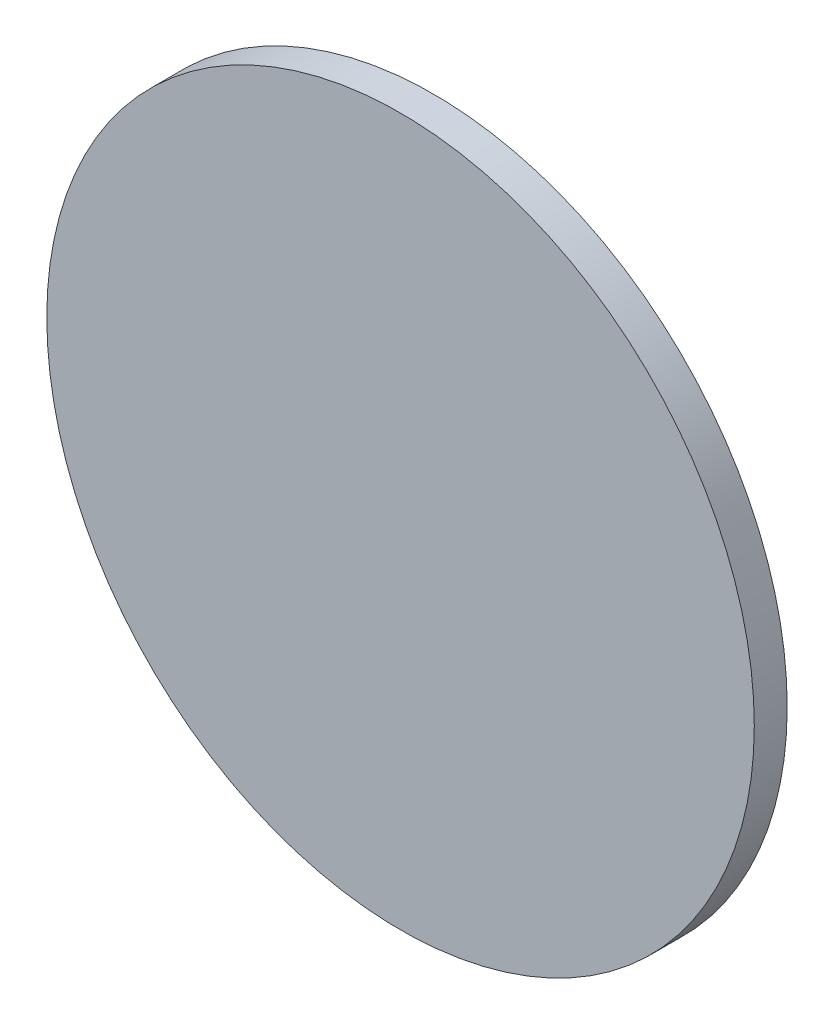
ISO-10303-21;
HEADER;
FILE_DESCRIPTION(('STEP AP214'),'2;1');
FILE_NAME('part.step','',(''),(''),'','','');
FILE_SCHEMA(('AUTOMOTIVE_DESIGN { 1 0 10303 214 1 1 1 1 }'));
ENDSEC;
DATA;
#1=APPLICATION_CONTEXT('core data for automotive mechanical design processes');
#2=APPLICATION_PROTOCOL_DEFINITION('international standard','automotive_design',2000,#1);
#3=PRODUCT_CONTEXT('',#1,'mechanical');
#4=PRODUCT('Part','Part','',(#3));
#5=PRODUCT_RELATED_PRODUCT_CATEGORY('part','',(#4));
#6=PRODUCT_DEFINITION_FORMATION('','',#4);
#7=PRODUCT_DEFINITION_CONTEXT('part definition',#1,'design');
#8=PRODUCT_DEFINITION('design','',#6,#7);
#9=PRODUCT_DEFINITION_SHAPE('','',#8);
#10=(LENGTH_UNIT() NAMED_UNIT(*) SI_UNIT(.MILLI.,.METRE.));
#11=(NAMED_UNIT(*) PLANE_ANGLE_UNIT() SI_UNIT($,.RADIAN.));
#12=(NAMED_UNIT(*) SI_UNIT($,.STERADIAN.) SOLID_ANGLE_UNIT());
#13=UNCERTAINTY_MEASURE_WITH_UNIT(LENGTH_MEASURE(1.E-05),#10,'distance_accuracy_value','');
#14=(GEOMETRIC_REPRESENTATION_CONTEXT(3) GLOBAL_UNCERTAINTY_ASSIGNED_CONTEXT((#13)) GLOBAL_UNIT_ASSIGNED_CONTEXT((#10,
#11,#12)) REPRESENTATION_CONTEXT('',''));
#15=CARTESIAN_POINT('',(0.,0.,0.));
#16=DIRECTION('',(0.,0.,1.));
#17=DIRECTION('',(1.,0.,0.));
#18=AXIS2_PLACEMENT_3D('',#15,#16,#17);
#19=CARTESIAN_POINT('',(0.,0.,3.));
#20=DIRECTION('',(0.,0.,-1.));
#21=DIRECTION('',(-1.,0.,0.));
#22=AXIS2_PLACEMENT_3D('',#19,#20,#21);
#23=CYLINDRICAL_SURFACE('',#22,32.25);
#24=CARTESIAN_POINT('',(0.,0.,3.));
#25=DIRECTION('',(0.,0.,1.));
#26=DIRECTION('',(1.,0.,0.));
#27=AXIS2_PLACEMENT_3D('',#24,#25,#26);
#28=CIRCLE('',#27,32.25);
#29=CARTESIAN_POINT('',(32.25,0.,3.));
#30=VERTEX_POINT('',#29);
#31=EDGE_CURVE('E10',#30,#30,#28,.T.);
#32=ORIENTED_EDGE('',*,*,#31,.F.);
#33=EDGE_LOOP('',(#32));
#34=FACE_BOUND('',#33,.T.);
#35=CARTESIAN_POINT('',(0.,0.,0.));
#36=DIRECTION('',(0.,0.,1.));
#37=DIRECTION('',(1.,0.,0.));
#38=AXIS2_PLACEMENT_3D('',#35,#36,#37);
#39=CIRCLE('',#38,32.25);
#40=CARTESIAN_POINT('',(32.25,0.,0.));
#41=VERTEX_POINT('',#40);
#42=EDGE_CURVE('E38',#41,#41,#39,.T.);
#43=ORIENTED_EDGE('',*,*,#42,.T.);
#44=EDGE_LOOP('',(#43));
#45=FACE_BOUND('',#44,.T.);
#46=ADVANCED_FACE('F35',(#34,#45),#23,.T.);
#47=CARTESIAN_POINT('',(0.,0.,3.));
#48=DIRECTION('',(0.,0.,1.));
#49=DIRECTION('',(1.,0.,0.));
#50=AXIS2_PLACEMENT_3D('',#47,#48,#49);
#51=PLANE('',#50);
#52=ORIENTED_EDGE('',*,*,#31,.T.);
#53=EDGE_LOOP('',(#52));
#54=FACE_BOUND('',#53,.T.);
#55=ADVANCED_FACE('F50',(#54),#51,.T.);
#56=CARTESIAN_POINT('',(0.,0.,0.));
#57=DIRECTION('',(0.,0.,1.));
#58=DIRECTION('',(1.,0.,0.));
#59=AXIS2_PLACEMENT_3D('',#56,#57,#58);
#60=PLANE('',#59);
#61=ORIENTED_EDGE('',*,*,#42,.F.);
#62=EDGE_LOOP('',(#61));
#63=FACE_BOUND('',#62,.T.);
#64=ADVANCED_FACE('F48',(#63),#60,.F.);
#65=CLOSED_SHELL('',(#46,#55,#64));
#66=MANIFOLD_SOLID_BREP('B2',#65);
#67=ADVANCED_BREP_SHAPE_REPRESENTATION('',(#18,#66),#14);
#68=SHAPE_DEFINITION_REPRESENTATION(#9,#67);
ENDSEC;
END-ISO-10303-21;
